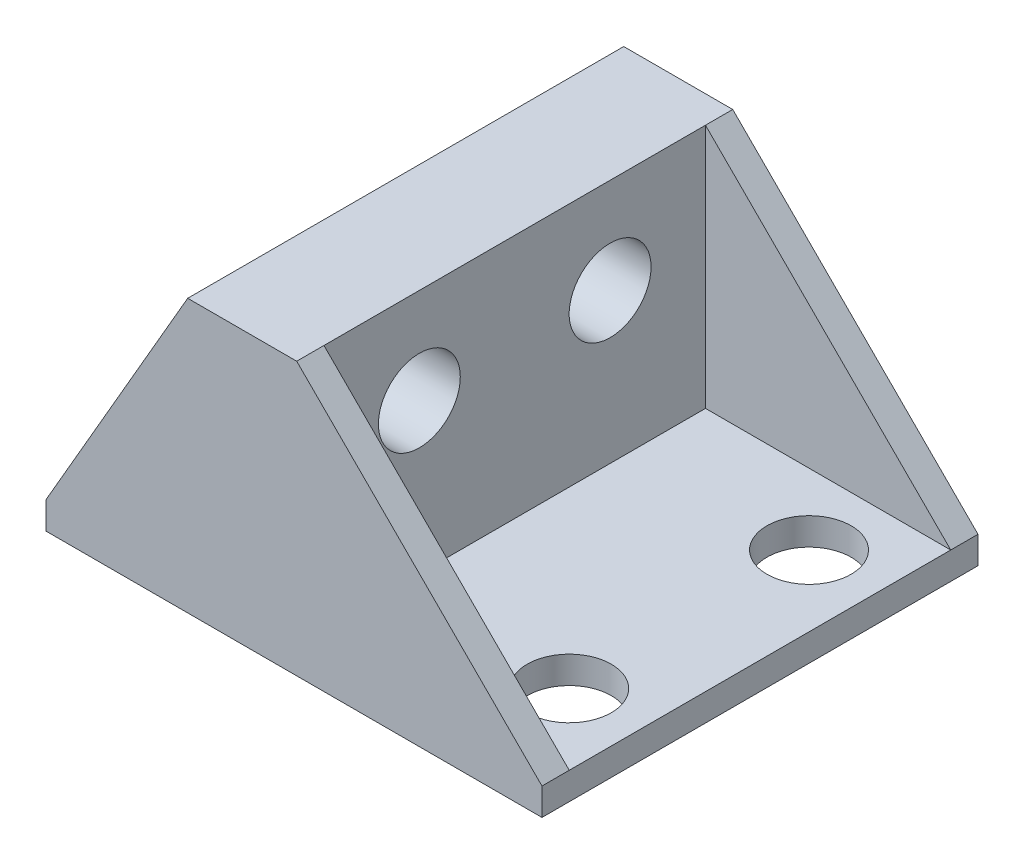
ISO-10303-21;
HEADER;
FILE_DESCRIPTION(('STEP AP214'),'2;1');
FILE_NAME('part.step','',(''),(''),'','','');
FILE_SCHEMA(('AUTOMOTIVE_DESIGN { 1 0 10303 214 1 1 1 1 }'));
ENDSEC;
DATA;
#1=APPLICATION_CONTEXT('core data for automotive mechanical design processes');
#2=APPLICATION_PROTOCOL_DEFINITION('international standard','automotive_design',2000,#1);
#3=PRODUCT_CONTEXT('',#1,'mechanical');
#4=PRODUCT('Part','Part','',(#3));
#5=PRODUCT_RELATED_PRODUCT_CATEGORY('part','',(#4));
#6=PRODUCT_DEFINITION_FORMATION('','',#4);
#7=PRODUCT_DEFINITION_CONTEXT('part definition',#1,'design');
#8=PRODUCT_DEFINITION('design','',#6,#7);
#9=PRODUCT_DEFINITION_SHAPE('','',#8);
#10=(LENGTH_UNIT() NAMED_UNIT(*) SI_UNIT(.MILLI.,.METRE.));
#11=(NAMED_UNIT(*) PLANE_ANGLE_UNIT() SI_UNIT($,.RADIAN.));
#12=(NAMED_UNIT(*) SI_UNIT($,.STERADIAN.) SOLID_ANGLE_UNIT());
#13=UNCERTAINTY_MEASURE_WITH_UNIT(LENGTH_MEASURE(1.E-05),#10,'distance_accuracy_value','');
#14=(GEOMETRIC_REPRESENTATION_CONTEXT(3) GLOBAL_UNCERTAINTY_ASSIGNED_CONTEXT((#13)) GLOBAL_UNIT_ASSIGNED_CONTEXT((#10,
#11,#12)) REPRESENTATION_CONTEXT('',''));
#15=CARTESIAN_POINT('',(0.,0.,0.));
#16=DIRECTION('',(0.,0.,1.));
#17=DIRECTION('',(1.,0.,0.));
#18=AXIS2_PLACEMENT_3D('',#15,#16,#17);
#19=CARTESIAN_POINT('',(0.,15.875,0.));
#20=DIRECTION('',(0.,-1.,0.));
#21=DIRECTION('',(0.,0.,-1.));
#22=AXIS2_PLACEMENT_3D('',#19,#20,#21);
#23=PLANE('',#22);
#24=CARTESIAN_POINT('',(107.015,15.875,8.255));
#25=DIRECTION('',(0.,1.,0.));
#26=DIRECTION('',(0.,0.,1.));
#27=AXIS2_PLACEMENT_3D('',#24,#25,#26);
#28=CIRCLE('',#27,4.90219999999998);
#29=CARTESIAN_POINT('',(107.015,15.875,13.1572));
#30=VERTEX_POINT('',#29);
#31=EDGE_CURVE('E276',#30,#30,#28,.T.);
#32=ORIENTED_EDGE('',*,*,#31,.F.);
#33=EDGE_LOOP('',(#32));
#34=FACE_BOUND('',#33,.T.);
#35=DIRECTION('',(1.,0.,0.));
#36=VECTOR('',#35,1.);
#37=CARTESIAN_POINT('',(156.545,15.875,44.45));
#38=LINE('',#37,#36);
#39=CARTESIAN_POINT('',(98.76,15.875,44.45));
#40=VERTEX_POINT('',#39);
#41=CARTESIAN_POINT('',(115.27,15.875,44.45));
#42=VERTEX_POINT('',#41);
#43=EDGE_CURVE('E225',#40,#42,#38,.T.);
#44=ORIENTED_EDGE('',*,*,#43,.T.);
#45=DIRECTION('',(0.,0.,-1.));
#46=VECTOR('',#45,1.);
#47=CARTESIAN_POINT('',(115.27,15.875,0.));
#48=LINE('',#47,#46);
#49=CARTESIAN_POINT('',(115.27,15.875,0.));
#50=VERTEX_POINT('',#49);
#51=EDGE_CURVE('E11',#42,#50,#48,.T.);
#52=ORIENTED_EDGE('',*,*,#51,.T.);
#53=DIRECTION('',(-1.,0.,0.));
#54=VECTOR('',#53,1.);
#55=CARTESIAN_POINT('',(156.545,15.875,0.));
#56=LINE('',#55,#54);
#57=CARTESIAN_POINT('',(98.76,15.875,0.));
#58=VERTEX_POINT('',#57);
#59=EDGE_CURVE('E221',#50,#58,#56,.T.);
#60=ORIENTED_EDGE('',*,*,#59,.T.);
#61=DIRECTION('',(0.,0.,1.));
#62=VECTOR('',#61,1.);
#63=CARTESIAN_POINT('',(98.76,15.875,44.45));
#64=LINE('',#63,#62);
#65=EDGE_CURVE('E220',#58,#40,#64,.T.);
#66=ORIENTED_EDGE('',*,*,#65,.T.);
#67=EDGE_LOOP('',(#44,#52,#60,#66));
#68=FACE_BOUND('',#67,.T.);
#69=CARTESIAN_POINT('',(107.015,15.875,36.195));
#70=DIRECTION('',(0.,1.,0.));
#71=DIRECTION('',(0.,0.,1.));
#72=AXIS2_PLACEMENT_3D('',#69,#70,#71);
#73=CIRCLE('',#72,4.90219999999998);
#74=CARTESIAN_POINT('',(107.015,15.875,41.0972));
#75=VERTEX_POINT('',#74);
#76=EDGE_CURVE('E266',#75,#75,#73,.T.);
#77=ORIENTED_EDGE('',*,*,#76,.F.);
#78=EDGE_LOOP('',(#77));
#79=FACE_BOUND('',#78,.T.);
#80=ADVANCED_FACE('F43',(#34,#68,#79),#23,.F.);
#81=CARTESIAN_POINT('',(127.97,44.45,44.45));
#82=DIRECTION('',(-1.,0.,0.));
#83=DIRECTION('',(0.,0.,1.));
#84=AXIS2_PLACEMENT_3D('',#81,#82,#83);
#85=PLANE('',#84);
#86=CARTESIAN_POINT('',(127.97,33.3375,33.3375));
#87=DIRECTION('',(1.,0.,0.));
#88=DIRECTION('',(0.,0.,-1.));
#89=AXIS2_PLACEMENT_3D('',#86,#87,#88);
#90=CIRCLE('',#89,4.77);
#91=CARTESIAN_POINT('',(127.97,33.3375,28.5675));
#92=VERTEX_POINT('',#91);
#93=EDGE_CURVE('E235',#92,#92,#90,.T.);
#94=ORIENTED_EDGE('',*,*,#93,.F.);
#95=EDGE_LOOP('',(#94));
#96=FACE_BOUND('',#95,.T.);
#97=CARTESIAN_POINT('',(127.97,33.3375,11.1125));
#98=DIRECTION('',(1.,0.,0.));
#99=DIRECTION('',(0.,0.,-1.));
#100=AXIS2_PLACEMENT_3D('',#97,#98,#99);
#101=CIRCLE('',#100,4.77);
#102=CARTESIAN_POINT('',(127.97,33.3375,6.34249999999999));
#103=VERTEX_POINT('',#102);
#104=EDGE_CURVE('E236',#103,#103,#101,.T.);
#105=ORIENTED_EDGE('',*,*,#104,.F.);
#106=EDGE_LOOP('',(#105));
#107=FACE_BOUND('',#106,.T.);
#108=DIRECTION('',(0.,0.,1.));
#109=VECTOR('',#108,1.);
#110=CARTESIAN_POINT('',(127.97,15.875,44.45));
#111=LINE('',#110,#109);
#112=CARTESIAN_POINT('',(127.97,15.875,0.));
#113=VERTEX_POINT('',#112);
#114=CARTESIAN_POINT('',(127.97,15.875,44.45));
#115=VERTEX_POINT('',#114);
#116=EDGE_CURVE('E230',#113,#115,#111,.T.);
#117=ORIENTED_EDGE('',*,*,#116,.F.);
#118=DIRECTION('',(0.,-1.,0.));
#119=VECTOR('',#118,1.);
#120=CARTESIAN_POINT('',(127.97,44.45,0.));
#121=LINE('',#120,#119);
#122=CARTESIAN_POINT('',(127.97,44.45,0.));
#123=VERTEX_POINT('',#122);
#124=EDGE_CURVE('E60',#123,#113,#121,.T.);
#125=ORIENTED_EDGE('',*,*,#124,.F.);
#126=DIRECTION('',(0.,0.,-1.));
#127=VECTOR('',#126,1.);
#128=CARTESIAN_POINT('',(127.97,44.45,44.45));
#129=LINE('',#128,#127);
#130=CARTESIAN_POINT('',(127.97,44.45,44.45));
#131=VERTEX_POINT('',#130);
#132=EDGE_CURVE('E242',#131,#123,#129,.T.);
#133=ORIENTED_EDGE('',*,*,#132,.F.);
#134=DIRECTION('',(0.,-1.,0.));
#135=VECTOR('',#134,1.);
#136=CARTESIAN_POINT('',(127.97,44.45,44.45));
#137=LINE('',#136,#135);
#138=EDGE_CURVE('E52',#131,#115,#137,.T.);
#139=ORIENTED_EDGE('',*,*,#138,.T.);
#140=EDGE_LOOP('',(#117,#125,#133,#139));
#141=FACE_BOUND('',#140,.T.);
#142=ADVANCED_FACE('F45',(#96,#107,#141),#85,.F.);
#143=CARTESIAN_POINT('',(115.27,44.45,0.));
#144=DIRECTION('',(1.,0.,0.));
#145=DIRECTION('',(0.,0.,-1.));
#146=AXIS2_PLACEMENT_3D('',#143,#144,#145);
#147=PLANE('',#146);
#148=CARTESIAN_POINT('',(115.27,33.3375,33.3375));
#149=DIRECTION('',(1.,0.,0.));
#150=DIRECTION('',(0.,0.,-1.));
#151=AXIS2_PLACEMENT_3D('',#148,#149,#150);
#152=CIRCLE('',#151,4.77);
#153=CARTESIAN_POINT('',(115.27,33.3375,28.5675));
#154=VERTEX_POINT('',#153);
#155=EDGE_CURVE('E239',#154,#154,#152,.T.);
#156=ORIENTED_EDGE('',*,*,#155,.T.);
#157=EDGE_LOOP('',(#156));
#158=FACE_BOUND('',#157,.T.);
#159=CARTESIAN_POINT('',(115.27,33.3375,11.1125));
#160=DIRECTION('',(1.,0.,0.));
#161=DIRECTION('',(0.,0.,-1.));
#162=AXIS2_PLACEMENT_3D('',#159,#160,#161);
#163=CIRCLE('',#162,4.77);
#164=CARTESIAN_POINT('',(115.27,33.3375,6.34249999999999));
#165=VERTEX_POINT('',#164);
#166=EDGE_CURVE('E246',#165,#165,#163,.T.);
#167=ORIENTED_EDGE('',*,*,#166,.T.);
#168=EDGE_LOOP('',(#167));
#169=FACE_BOUND('',#168,.T.);
#170=ORIENTED_EDGE('',*,*,#51,.F.);
#171=DIRECTION('',(0.,-1.,0.));
#172=VECTOR('',#171,1.);
#173=CARTESIAN_POINT('',(115.27,44.45,44.45));
#174=LINE('',#173,#172);
#175=CARTESIAN_POINT('',(115.27,44.45,44.45));
#176=VERTEX_POINT('',#175);
#177=EDGE_CURVE('E68',#176,#42,#174,.T.);
#178=ORIENTED_EDGE('',*,*,#177,.F.);
#179=DIRECTION('',(0.,0.,1.));
#180=VECTOR('',#179,1.);
#181=CARTESIAN_POINT('',(115.27,44.45,0.));
#182=LINE('',#181,#180);
#183=CARTESIAN_POINT('',(115.27,44.45,0.));
#184=VERTEX_POINT('',#183);
#185=EDGE_CURVE('E245',#184,#176,#182,.T.);
#186=ORIENTED_EDGE('',*,*,#185,.F.);
#187=DIRECTION('',(0.,-1.,0.));
#188=VECTOR('',#187,1.);
#189=CARTESIAN_POINT('',(115.27,44.45,0.));
#190=LINE('',#189,#188);
#191=EDGE_CURVE('E250',#184,#50,#190,.T.);
#192=ORIENTED_EDGE('',*,*,#191,.T.);
#193=EDGE_LOOP('',(#170,#178,#186,#192));
#194=FACE_BOUND('',#193,.T.);
#195=ADVANCED_FACE('F308',(#158,#169,#194),#147,.F.);
#196=CARTESIAN_POINT('',(0.,44.45,0.));
#197=DIRECTION('',(0.,1.,0.));
#198=DIRECTION('',(0.,0.,1.));
#199=AXIS2_PLACEMENT_3D('',#196,#197,#198);
#200=PLANE('',#199);
#201=ORIENTED_EDGE('',*,*,#185,.T.);
#202=DIRECTION('',(0.,0.,-1.));
#203=VECTOR('',#202,1.);
#204=CARTESIAN_POINT('',(115.27,44.45,47.625));
#205=LINE('',#204,#203);
#206=CARTESIAN_POINT('',(115.27,44.45,47.625));
#207=VERTEX_POINT('',#206);
#208=EDGE_CURVE('E188',#207,#176,#205,.T.);
#209=ORIENTED_EDGE('',*,*,#208,.F.);
#210=DIRECTION('',(1.,0.,0.));
#211=VECTOR('',#210,1.);
#212=CARTESIAN_POINT('',(115.27,44.45,47.625));
#213=LINE('',#212,#211);
#214=CARTESIAN_POINT('',(127.97,44.45,47.625));
#215=VERTEX_POINT('',#214);
#216=EDGE_CURVE('E172',#207,#215,#213,.T.);
#217=ORIENTED_EDGE('',*,*,#216,.T.);
#218=DIRECTION('',(0.,0.,-1.));
#219=VECTOR('',#218,1.);
#220=CARTESIAN_POINT('',(127.97,44.45,47.625));
#221=LINE('',#220,#219);
#222=EDGE_CURVE('E185',#215,#131,#221,.T.);
#223=ORIENTED_EDGE('',*,*,#222,.T.);
#224=ORIENTED_EDGE('',*,*,#132,.T.);
#225=DIRECTION('',(0.,0.,1.));
#226=VECTOR('',#225,1.);
#227=CARTESIAN_POINT('',(127.97,44.45,-3.175));
#228=LINE('',#227,#226);
#229=CARTESIAN_POINT('',(127.97,44.45,-3.175));
#230=VERTEX_POINT('',#229);
#231=EDGE_CURVE('E211',#230,#123,#228,.T.);
#232=ORIENTED_EDGE('',*,*,#231,.F.);
#233=DIRECTION('',(1.,0.,0.));
#234=VECTOR('',#233,1.);
#235=CARTESIAN_POINT('',(127.97,44.45,-3.175));
#236=LINE('',#235,#234);
#237=CARTESIAN_POINT('',(115.27,44.45,-3.175));
#238=VERTEX_POINT('',#237);
#239=EDGE_CURVE('E197',#238,#230,#236,.T.);
#240=ORIENTED_EDGE('',*,*,#239,.F.);
#241=DIRECTION('',(0.,0.,1.));
#242=VECTOR('',#241,1.);
#243=CARTESIAN_POINT('',(115.27,44.45,-3.175));
#244=LINE('',#243,#242);
#245=EDGE_CURVE('E213',#238,#184,#244,.T.);
#246=ORIENTED_EDGE('',*,*,#245,.T.);
#247=EDGE_LOOP('',(#201,#209,#217,#223,#224,#232,#240,#246));
#248=FACE_BOUND('',#247,.T.);
#249=ADVANCED_FACE('F345',(#248),#200,.T.);
#250=CARTESIAN_POINT('',(0.,12.7,0.));
#251=DIRECTION('',(0.,1.,0.));
#252=DIRECTION('',(0.,0.,1.));
#253=AXIS2_PLACEMENT_3D('',#250,#251,#252);
#254=PLANE('',#253);
#255=CARTESIAN_POINT('',(107.015,12.7,8.255));
#256=DIRECTION('',(0.,1.,0.));
#257=DIRECTION('',(0.,0.,1.));
#258=AXIS2_PLACEMENT_3D('',#255,#256,#257);
#259=CIRCLE('',#258,4.90219999999997);
#260=CARTESIAN_POINT('',(107.015,12.7,13.1572));
#261=VERTEX_POINT('',#260);
#262=EDGE_CURVE('E47',#261,#261,#259,.T.);
#263=ORIENTED_EDGE('',*,*,#262,.T.);
#264=EDGE_LOOP('',(#263));
#265=FACE_BOUND('',#264,.T.);
#266=CARTESIAN_POINT('',(107.015,12.7,36.195));
#267=DIRECTION('',(0.,1.,0.));
#268=DIRECTION('',(0.,0.,1.));
#269=AXIS2_PLACEMENT_3D('',#266,#267,#268);
#270=CIRCLE('',#269,4.90219999999997);
#271=CARTESIAN_POINT('',(107.015,12.7,41.0972));
#272=VERTEX_POINT('',#271);
#273=EDGE_CURVE('E264',#272,#272,#270,.T.);
#274=ORIENTED_EDGE('',*,*,#273,.T.);
#275=EDGE_LOOP('',(#274));
#276=FACE_BOUND('',#275,.T.);
#277=CARTESIAN_POINT('',(148.29,12.7,8.255));
#278=DIRECTION('',(0.,1.,0.));
#279=DIRECTION('',(0.,0.,1.));
#280=AXIS2_PLACEMENT_3D('',#277,#278,#279);
#281=CIRCLE('',#280,4.90219999999995);
#282=CARTESIAN_POINT('',(148.29,12.7,13.1572));
#283=VERTEX_POINT('',#282);
#284=EDGE_CURVE('E260',#283,#283,#281,.T.);
#285=ORIENTED_EDGE('',*,*,#284,.T.);
#286=EDGE_LOOP('',(#285));
#287=FACE_BOUND('',#286,.T.);
#288=CARTESIAN_POINT('',(148.29,12.7,36.195));
#289=DIRECTION('',(0.,1.,0.));
#290=DIRECTION('',(0.,0.,1.));
#291=AXIS2_PLACEMENT_3D('',#288,#289,#290);
#292=CIRCLE('',#291,4.90219999999995);
#293=CARTESIAN_POINT('',(148.29,12.7,41.0972));
#294=VERTEX_POINT('',#293);
#295=EDGE_CURVE('E168',#294,#294,#292,.T.);
#296=ORIENTED_EDGE('',*,*,#295,.T.);
#297=EDGE_LOOP('',(#296));
#298=FACE_BOUND('',#297,.T.);
#299=DIRECTION('',(0.,0.,-1.));
#300=VECTOR('',#299,1.);
#301=CARTESIAN_POINT('',(156.545,12.7,0.));
#302=LINE('',#301,#300);
#303=CARTESIAN_POINT('',(156.545,12.7,47.625));
#304=VERTEX_POINT('',#303);
#305=CARTESIAN_POINT('',(156.545,12.7,-3.175));
#306=VERTEX_POINT('',#305);
#307=EDGE_CURVE('E147',#304,#306,#302,.T.);
#308=ORIENTED_EDGE('',*,*,#307,.F.);
#309=DIRECTION('',(-1.,0.,0.));
#310=VECTOR('',#309,1.);
#311=CARTESIAN_POINT('',(115.27,12.7,47.625));
#312=LINE('',#311,#310);
#313=CARTESIAN_POINT('',(98.76,12.7,47.625));
#314=VERTEX_POINT('',#313);
#315=EDGE_CURVE('E155',#304,#314,#312,.T.);
#316=ORIENTED_EDGE('',*,*,#315,.T.);
#317=DIRECTION('',(0.,0.,1.));
#318=VECTOR('',#317,1.);
#319=CARTESIAN_POINT('',(98.76,12.7,44.45));
#320=LINE('',#319,#318);
#321=CARTESIAN_POINT('',(98.76,12.7,-3.175));
#322=VERTEX_POINT('',#321);
#323=EDGE_CURVE('E136',#322,#314,#320,.T.);
#324=ORIENTED_EDGE('',*,*,#323,.F.);
#325=DIRECTION('',(-1.,0.,0.));
#326=VECTOR('',#325,1.);
#327=CARTESIAN_POINT('',(98.76,12.7,-3.175));
#328=LINE('',#327,#326);
#329=EDGE_CURVE('E191',#306,#322,#328,.T.);
#330=ORIENTED_EDGE('',*,*,#329,.F.);
#331=EDGE_LOOP('',(#308,#316,#324,#330));
#332=FACE_BOUND('',#331,.T.);
#333=ADVANCED_FACE('F161',(#265,#276,#287,#298,#332),#254,.F.);
#334=CARTESIAN_POINT('',(108.92,33.3375,33.3375));
#335=DIRECTION('',(1.,0.,0.));
#336=DIRECTION('',(0.,0.,-1.));
#337=AXIS2_PLACEMENT_3D('',#334,#335,#336);
#338=CYLINDRICAL_SURFACE('',#337,4.77);
#339=CARTESIAN_POINT('',(127.97,33.3375,28.5675));
#340=CARTESIAN_POINT('',(127.837708333333,33.3375,28.5675));
#341=CARTESIAN_POINT('',(127.705416666667,33.3375,28.5675));
#342=CARTESIAN_POINT('',(127.440833333333,33.3375,28.5675));
#343=CARTESIAN_POINT('',(127.308541666667,33.3375,28.5675));
#344=CARTESIAN_POINT('',(127.043958333333,33.3375,28.5675));
#345=CARTESIAN_POINT('',(126.911666666667,33.3375,28.5675));
#346=CARTESIAN_POINT('',(126.647083333333,33.3375,28.5675));
#347=CARTESIAN_POINT('',(126.514791666667,33.3375,28.5675));
#348=CARTESIAN_POINT('',(126.250208333333,33.3375,28.5675));
#349=CARTESIAN_POINT('',(126.117916666667,33.3375,28.5675));
#350=CARTESIAN_POINT('',(125.853333333333,33.3375,28.5675));
#351=CARTESIAN_POINT('',(125.721041666667,33.3375,28.5675));
#352=CARTESIAN_POINT('',(125.456458333333,33.3375,28.5675));
#353=CARTESIAN_POINT('',(125.324166666667,33.3375,28.5675));
#354=CARTESIAN_POINT('',(125.059583333333,33.3375,28.5675));
#355=CARTESIAN_POINT('',(124.927291666667,33.3375,28.5675));
#356=CARTESIAN_POINT('',(124.662708333333,33.3375,28.5675));
#357=CARTESIAN_POINT('',(124.530416666667,33.3375,28.5675));
#358=CARTESIAN_POINT('',(124.265833333333,33.3375,28.5675));
#359=CARTESIAN_POINT('',(124.133541666667,33.3375,28.5675));
#360=CARTESIAN_POINT('',(123.868958333333,33.3375,28.5675));
#361=CARTESIAN_POINT('',(123.736666666667,33.3375,28.5675));
#362=CARTESIAN_POINT('',(123.472083333333,33.3375,28.5675));
#363=CARTESIAN_POINT('',(123.339791666667,33.3375,28.5675));
#364=CARTESIAN_POINT('',(123.075208333333,33.3375,28.5675));
#365=CARTESIAN_POINT('',(122.942916666667,33.3375,28.5675));
#366=CARTESIAN_POINT('',(122.678333333333,33.3375,28.5675));
#367=CARTESIAN_POINT('',(122.546041666667,33.3375,28.5675));
#368=CARTESIAN_POINT('',(122.281458333333,33.3375,28.5675));
#369=CARTESIAN_POINT('',(122.149166666667,33.3375,28.5675));
#370=CARTESIAN_POINT('',(121.884583333333,33.3375,28.5675));
#371=CARTESIAN_POINT('',(121.752291666667,33.3375,28.5675));
#372=CARTESIAN_POINT('',(121.487708333333,33.3375,28.5675));
#373=CARTESIAN_POINT('',(121.355416666667,33.3375,28.5675));
#374=CARTESIAN_POINT('',(121.090833333333,33.3375,28.5675));
#375=CARTESIAN_POINT('',(120.958541666667,33.3375,28.5675));
#376=CARTESIAN_POINT('',(120.693958333333,33.3375,28.5675));
#377=CARTESIAN_POINT('',(120.561666666667,33.3375,28.5675));
#378=CARTESIAN_POINT('',(120.297083333333,33.3375,28.5675));
#379=CARTESIAN_POINT('',(120.164791666667,33.3375,28.5675));
#380=CARTESIAN_POINT('',(119.900208333333,33.3375,28.5675));
#381=CARTESIAN_POINT('',(119.767916666667,33.3375,28.5675));
#382=CARTESIAN_POINT('',(119.503333333333,33.3375,28.5675));
#383=CARTESIAN_POINT('',(119.371041666667,33.3375,28.5675));
#384=CARTESIAN_POINT('',(119.106458333333,33.3375,28.5675));
#385=CARTESIAN_POINT('',(118.974166666667,33.3375,28.5675));
#386=CARTESIAN_POINT('',(118.709583333333,33.3375,28.5675));
#387=CARTESIAN_POINT('',(118.577291666667,33.3375,28.5675));
#388=CARTESIAN_POINT('',(118.312708333333,33.3375,28.5675));
#389=CARTESIAN_POINT('',(118.180416666667,33.3375,28.5675));
#390=CARTESIAN_POINT('',(117.915833333333,33.3375,28.5675));
#391=CARTESIAN_POINT('',(117.783541666667,33.3375,28.5675));
#392=CARTESIAN_POINT('',(117.518958333333,33.3375,28.5675));
#393=CARTESIAN_POINT('',(117.386666666667,33.3375,28.5675));
#394=CARTESIAN_POINT('',(117.122083333333,33.3375,28.5675));
#395=CARTESIAN_POINT('',(116.989791666667,33.3375,28.5675));
#396=CARTESIAN_POINT('',(116.725208333333,33.3375,28.5675));
#397=CARTESIAN_POINT('',(116.592916666667,33.3375,28.5675));
#398=CARTESIAN_POINT('',(116.328333333333,33.3375,28.5675));
#399=CARTESIAN_POINT('',(116.196041666667,33.3375,28.5675));
#400=CARTESIAN_POINT('',(115.931458333333,33.3375,28.5675));
#401=CARTESIAN_POINT('',(115.799166666667,33.3375,28.5675));
#402=CARTESIAN_POINT('',(115.534583333333,33.3375,28.5675));
#403=CARTESIAN_POINT('',(115.402291666667,33.3375,28.5675));
#404=CARTESIAN_POINT('',(115.27,33.3375,28.5675));
#405=B_SPLINE_CURVE_WITH_KNOTS('',3,(#339,#340,#341,#342,#343,#344,#345,#346,#347,#348,#349,
#350,#351,#352,#353,#354,#355,#356,#357,#358,#359,#360,#361,#362,#363,#364,#365,#366,#367,#368,
#369,#370,#371,#372,#373,#374,#375,#376,#377,#378,#379,#380,#381,#382,#383,#384,#385,#386,#387,
#388,#389,#390,#391,#392,#393,#394,#395,#396,#397,#398,#399,#400,#401,#402,#403,#404),
.UNSPECIFIED.,.F.,.F.,(4,2,2,2,2,2,2,2,2,2,2,2,2,2,2,2,2,2,2,2,2,2,2,2,2,2,2,2,2,2,2,2,4),(0.,
0.396874999999991,0.793749999999982,1.19062499999997,1.58749999999999,1.98437499999998,
2.38124999999997,2.77812499999999,3.17499999999998,3.57187499999999,3.96874999999998,
4.36562499999998,4.76249999999998,5.15937499999998,5.55624999999998,5.95312499999998,
6.34999999999998,6.74687499999999,7.14374999999998,7.54062499999998,7.93749999999997,
8.33437499999998,8.73124999999997,9.12812499999997,9.52499999999998,9.92187499999997,10.31875,
10.715625,11.1125,11.509375,11.90625,12.303125,12.7),.UNSPECIFIED.);
#406=EDGE_CURVE('BSEAM374',#92,#154,#405,.T.);
#407=ORIENTED_EDGE('',*,*,#93,.T.);
#408=ORIENTED_EDGE('',*,*,#155,.F.);
#409=ORIENTED_EDGE('',*,*,#406,.T.);
#410=ORIENTED_EDGE('',*,*,#406,.F.);
#411=EDGE_LOOP('',(#407,#409,#408,#410));
#412=FACE_BOUND('',#411,.T.);
#413=ADVANCED_FACE('F374',(#412),#338,.F.);
#414=CARTESIAN_POINT('',(108.92,33.3375,11.1125));
#415=DIRECTION('',(1.,0.,0.));
#416=DIRECTION('',(0.,0.,-1.));
#417=AXIS2_PLACEMENT_3D('',#414,#415,#416);
#418=CYLINDRICAL_SURFACE('',#417,4.77);
#419=CARTESIAN_POINT('',(127.97,33.3375,6.34249999999999));
#420=CARTESIAN_POINT('',(127.837708333333,33.3375,6.34249999999999));
#421=CARTESIAN_POINT('',(127.705416666667,33.3375,6.34249999999999));
#422=CARTESIAN_POINT('',(127.440833333333,33.3375,6.34249999999999));
#423=CARTESIAN_POINT('',(127.308541666667,33.3375,6.34249999999999));
#424=CARTESIAN_POINT('',(127.043958333333,33.3375,6.34249999999999));
#425=CARTESIAN_POINT('',(126.911666666667,33.3375,6.34249999999999));
#426=CARTESIAN_POINT('',(126.647083333333,33.3375,6.34249999999999));
#427=CARTESIAN_POINT('',(126.514791666667,33.3375,6.34249999999999));
#428=CARTESIAN_POINT('',(126.250208333333,33.3375,6.34249999999999));
#429=CARTESIAN_POINT('',(126.117916666667,33.3375,6.34249999999999));
#430=CARTESIAN_POINT('',(125.853333333333,33.3375,6.34249999999999));
#431=CARTESIAN_POINT('',(125.721041666667,33.3375,6.34249999999999));
#432=CARTESIAN_POINT('',(125.456458333333,33.3375,6.34249999999999));
#433=CARTESIAN_POINT('',(125.324166666667,33.3375,6.34249999999999));
#434=CARTESIAN_POINT('',(125.059583333333,33.3375,6.34249999999999));
#435=CARTESIAN_POINT('',(124.927291666667,33.3375,6.34249999999999));
#436=CARTESIAN_POINT('',(124.662708333333,33.3375,6.34249999999999));
#437=CARTESIAN_POINT('',(124.530416666667,33.3375,6.34249999999999));
#438=CARTESIAN_POINT('',(124.265833333333,33.3375,6.34249999999999));
#439=CARTESIAN_POINT('',(124.133541666667,33.3375,6.34249999999999));
#440=CARTESIAN_POINT('',(123.868958333333,33.3375,6.34249999999999));
#441=CARTESIAN_POINT('',(123.736666666667,33.3375,6.34249999999999));
#442=CARTESIAN_POINT('',(123.472083333333,33.3375,6.34249999999999));
#443=CARTESIAN_POINT('',(123.339791666667,33.3375,6.34249999999999));
#444=CARTESIAN_POINT('',(123.075208333333,33.3375,6.34249999999999));
#445=CARTESIAN_POINT('',(122.942916666667,33.3375,6.34249999999999));
#446=CARTESIAN_POINT('',(122.678333333333,33.3375,6.34249999999999));
#447=CARTESIAN_POINT('',(122.546041666667,33.3375,6.34249999999999));
#448=CARTESIAN_POINT('',(122.281458333333,33.3375,6.34249999999999));
#449=CARTESIAN_POINT('',(122.149166666667,33.3375,6.34249999999999));
#450=CARTESIAN_POINT('',(121.884583333333,33.3375,6.34249999999999));
#451=CARTESIAN_POINT('',(121.752291666667,33.3375,6.34249999999999));
#452=CARTESIAN_POINT('',(121.487708333333,33.3375,6.34249999999999));
#453=CARTESIAN_POINT('',(121.355416666667,33.3375,6.34249999999999));
#454=CARTESIAN_POINT('',(121.090833333333,33.3375,6.34249999999999));
#455=CARTESIAN_POINT('',(120.958541666667,33.3375,6.34249999999999));
#456=CARTESIAN_POINT('',(120.693958333333,33.3375,6.34249999999999));
#457=CARTESIAN_POINT('',(120.561666666667,33.3375,6.34249999999999));
#458=CARTESIAN_POINT('',(120.297083333333,33.3375,6.34249999999999));
#459=CARTESIAN_POINT('',(120.164791666667,33.3375,6.34249999999999));
#460=CARTESIAN_POINT('',(119.900208333333,33.3375,6.34249999999999));
#461=CARTESIAN_POINT('',(119.767916666667,33.3375,6.34249999999999));
#462=CARTESIAN_POINT('',(119.503333333333,33.3375,6.34249999999999));
#463=CARTESIAN_POINT('',(119.371041666667,33.3375,6.34249999999999));
#464=CARTESIAN_POINT('',(119.106458333333,33.3375,6.34249999999999));
#465=CARTESIAN_POINT('',(118.974166666667,33.3375,6.34249999999999));
#466=CARTESIAN_POINT('',(118.709583333333,33.3375,6.34249999999999));
#467=CARTESIAN_POINT('',(118.577291666667,33.3375,6.34249999999999));
#468=CARTESIAN_POINT('',(118.312708333333,33.3375,6.34249999999999));
#469=CARTESIAN_POINT('',(118.180416666667,33.3375,6.34249999999999));
#470=CARTESIAN_POINT('',(117.915833333333,33.3375,6.34249999999999));
#471=CARTESIAN_POINT('',(117.783541666667,33.3375,6.34249999999999));
#472=CARTESIAN_POINT('',(117.518958333333,33.3375,6.34249999999999));
#473=CARTESIAN_POINT('',(117.386666666667,33.3375,6.34249999999999));
#474=CARTESIAN_POINT('',(117.122083333333,33.3375,6.34249999999999));
#475=CARTESIAN_POINT('',(116.989791666667,33.3375,6.34249999999999));
#476=CARTESIAN_POINT('',(116.725208333333,33.3375,6.34249999999999));
#477=CARTESIAN_POINT('',(116.592916666667,33.3375,6.34249999999999));
#478=CARTESIAN_POINT('',(116.328333333333,33.3375,6.34249999999999));
#479=CARTESIAN_POINT('',(116.196041666667,33.3375,6.34249999999999));
#480=CARTESIAN_POINT('',(115.931458333333,33.3375,6.34249999999999));
#481=CARTESIAN_POINT('',(115.799166666667,33.3375,6.34249999999999));
#482=CARTESIAN_POINT('',(115.534583333333,33.3375,6.34249999999999));
#483=CARTESIAN_POINT('',(115.402291666667,33.3375,6.34249999999999));
#484=CARTESIAN_POINT('',(115.27,33.3375,6.34249999999999));
#485=B_SPLINE_CURVE_WITH_KNOTS('',3,(#419,#420,#421,#422,#423,#424,#425,#426,#427,#428,#429,
#430,#431,#432,#433,#434,#435,#436,#437,#438,#439,#440,#441,#442,#443,#444,#445,#446,#447,#448,
#449,#450,#451,#452,#453,#454,#455,#456,#457,#458,#459,#460,#461,#462,#463,#464,#465,#466,#467,
#468,#469,#470,#471,#472,#473,#474,#475,#476,#477,#478,#479,#480,#481,#482,#483,#484),
.UNSPECIFIED.,.F.,.F.,(4,2,2,2,2,2,2,2,2,2,2,2,2,2,2,2,2,2,2,2,2,2,2,2,2,2,2,2,2,2,2,2,4),(0.,
0.396874999999991,0.793749999999982,1.19062499999997,1.58749999999999,1.98437499999998,
2.38124999999997,2.77812499999999,3.17499999999998,3.57187499999999,3.96874999999998,
4.36562499999998,4.76249999999998,5.15937499999998,5.55624999999998,5.95312499999998,
6.34999999999998,6.74687499999999,7.14374999999998,7.54062499999998,7.93749999999997,
8.33437499999998,8.73124999999997,9.12812499999997,9.52499999999998,9.92187499999997,10.31875,
10.715625,11.1125,11.509375,11.90625,12.303125,12.7),.UNSPECIFIED.);
#486=EDGE_CURVE('BSEAM325',#103,#165,#485,.T.);
#487=ORIENTED_EDGE('',*,*,#104,.T.);
#488=ORIENTED_EDGE('',*,*,#166,.F.);
#489=ORIENTED_EDGE('',*,*,#486,.T.);
#490=ORIENTED_EDGE('',*,*,#486,.F.);
#491=EDGE_LOOP('',(#487,#489,#488,#490));
#492=FACE_BOUND('',#491,.T.);
#493=ADVANCED_FACE('F325',(#492),#418,.F.);
#494=CARTESIAN_POINT('',(98.76,15.875,44.45));
#495=DIRECTION('',(1.,0.,0.));
#496=DIRECTION('',(0.,0.,-1.));
#497=AXIS2_PLACEMENT_3D('',#494,#495,#496);
#498=PLANE('',#497);
#499=ORIENTED_EDGE('',*,*,#323,.T.);
#500=DIRECTION('',(0.,1.,0.));
#501=VECTOR('',#500,1.);
#502=CARTESIAN_POINT('',(98.76,44.45,47.625));
#503=LINE('',#502,#501);
#504=CARTESIAN_POINT('',(98.76,15.875,47.625));
#505=VERTEX_POINT('',#504);
#506=EDGE_CURVE('E140',#314,#505,#503,.T.);
#507=ORIENTED_EDGE('',*,*,#506,.T.);
#508=DIRECTION('',(0.,0.,-1.));
#509=VECTOR('',#508,1.);
#510=CARTESIAN_POINT('',(98.76,15.875,47.625));
#511=LINE('',#510,#509);
#512=EDGE_CURVE('E180',#505,#40,#511,.T.);
#513=ORIENTED_EDGE('',*,*,#512,.T.);
#514=ORIENTED_EDGE('',*,*,#65,.F.);
#515=DIRECTION('',(0.,0.,1.));
#516=VECTOR('',#515,1.);
#517=CARTESIAN_POINT('',(98.76,15.875,-3.175));
#518=LINE('',#517,#516);
#519=CARTESIAN_POINT('',(98.76,15.875,-3.175));
#520=VERTEX_POINT('',#519);
#521=EDGE_CURVE('E148',#520,#58,#518,.T.);
#522=ORIENTED_EDGE('',*,*,#521,.F.);
#523=DIRECTION('',(0.,1.,0.));
#524=VECTOR('',#523,1.);
#525=CARTESIAN_POINT('',(98.76,15.875,-3.175));
#526=LINE('',#525,#524);
#527=EDGE_CURVE('E142',#322,#520,#526,.T.);
#528=ORIENTED_EDGE('',*,*,#527,.F.);
#529=EDGE_LOOP('',(#499,#507,#513,#514,#522,#528));
#530=FACE_BOUND('',#529,.T.);
#531=ADVANCED_FACE('F138',(#530),#498,.F.);
#532=CARTESIAN_POINT('',(148.29,15.875,8.255));
#533=DIRECTION('',(0.,1.,0.));
#534=DIRECTION('',(0.,0.,1.));
#535=AXIS2_PLACEMENT_3D('',#532,#533,#534);
#536=CIRCLE('',#535,4.90219999999997);
#537=CARTESIAN_POINT('',(148.29,15.875,13.1572));
#538=VERTEX_POINT('',#537);
#539=EDGE_CURVE('E263',#538,#538,#536,.T.);
#540=ORIENTED_EDGE('',*,*,#539,.F.);
#541=EDGE_LOOP('',(#540));
#542=FACE_BOUND('',#541,.T.);
#543=CARTESIAN_POINT('',(148.29,15.875,36.195));
#544=DIRECTION('',(0.,1.,0.));
#545=DIRECTION('',(0.,0.,1.));
#546=AXIS2_PLACEMENT_3D('',#543,#544,#545);
#547=CIRCLE('',#546,4.90219999999997);
#548=CARTESIAN_POINT('',(148.29,15.875,41.0972));
#549=VERTEX_POINT('',#548);
#550=EDGE_CURVE('E262',#549,#549,#547,.T.);
#551=ORIENTED_EDGE('',*,*,#550,.F.);
#552=EDGE_LOOP('',(#551));
#553=FACE_BOUND('',#552,.T.);
#554=CARTESIAN_POINT('',(156.545,15.875,0.));
#555=VERTEX_POINT('',#554);
#556=EDGE_CURVE('E217',#555,#113,#56,.T.);
#557=ORIENTED_EDGE('',*,*,#556,.T.);
#558=ORIENTED_EDGE('',*,*,#116,.T.);
#559=CARTESIAN_POINT('',(156.545,15.875,44.45));
#560=VERTEX_POINT('',#559);
#561=EDGE_CURVE('E224',#115,#560,#38,.T.);
#562=ORIENTED_EDGE('',*,*,#561,.T.);
#563=DIRECTION('',(0.,0.,-1.));
#564=VECTOR('',#563,1.);
#565=CARTESIAN_POINT('',(156.545,15.875,0.));
#566=LINE('',#565,#564);
#567=EDGE_CURVE('E228',#560,#555,#566,.T.);
#568=ORIENTED_EDGE('',*,*,#567,.T.);
#569=EDGE_LOOP('',(#557,#558,#562,#568));
#570=FACE_BOUND('',#569,.T.);
#571=ADVANCED_FACE('F303',(#542,#553,#570),#23,.F.);
#572=CARTESIAN_POINT('',(156.545,15.875,0.));
#573=DIRECTION('',(-1.,0.,0.));
#574=DIRECTION('',(0.,0.,1.));
#575=AXIS2_PLACEMENT_3D('',#572,#573,#574);
#576=PLANE('',#575);
#577=ORIENTED_EDGE('',*,*,#307,.T.);
#578=DIRECTION('',(0.,-1.,0.));
#579=VECTOR('',#578,1.);
#580=CARTESIAN_POINT('',(156.545,12.7,-3.175));
#581=LINE('',#580,#579);
#582=CARTESIAN_POINT('',(156.545,15.875,-3.175));
#583=VERTEX_POINT('',#582);
#584=EDGE_CURVE('E201',#583,#306,#581,.T.);
#585=ORIENTED_EDGE('',*,*,#584,.F.);
#586=DIRECTION('',(0.,0.,1.));
#587=VECTOR('',#586,1.);
#588=CARTESIAN_POINT('',(156.545,15.875,-3.175));
#589=LINE('',#588,#587);
#590=EDGE_CURVE('E204',#583,#555,#589,.T.);
#591=ORIENTED_EDGE('',*,*,#590,.T.);
#592=ORIENTED_EDGE('',*,*,#567,.F.);
#593=DIRECTION('',(0.,0.,-1.));
#594=VECTOR('',#593,1.);
#595=CARTESIAN_POINT('',(156.545,15.875,47.625));
#596=LINE('',#595,#594);
#597=CARTESIAN_POINT('',(156.545,15.875,47.625));
#598=VERTEX_POINT('',#597);
#599=EDGE_CURVE('E182',#598,#560,#596,.T.);
#600=ORIENTED_EDGE('',*,*,#599,.F.);
#601=DIRECTION('',(0.,-1.,0.));
#602=VECTOR('',#601,1.);
#603=CARTESIAN_POINT('',(156.545,44.45,47.625));
#604=LINE('',#603,#602);
#605=EDGE_CURVE('E178',#598,#304,#604,.T.);
#606=ORIENTED_EDGE('',*,*,#605,.T.);
#607=EDGE_LOOP('',(#577,#585,#591,#592,#600,#606));
#608=FACE_BOUND('',#607,.T.);
#609=ADVANCED_FACE('F315',(#608),#576,.F.);
#610=CARTESIAN_POINT('',(0.,0.,0.));
#611=DIRECTION('',(0.,0.,1.));
#612=DIRECTION('',(1.,0.,0.));
#613=AXIS2_PLACEMENT_3D('',#610,#611,#612);
#614=PLANE('',#613);
#615=ORIENTED_EDGE('',*,*,#59,.F.);
#616=ORIENTED_EDGE('',*,*,#191,.F.);
#617=DIRECTION('',(0.500277597874629,0.865865073244551,0.));
#618=VECTOR('',#617,1.);
#619=CARTESIAN_POINT('',(115.27,44.45,0.));
#620=LINE('',#619,#618);
#621=EDGE_CURVE('E184',#58,#184,#620,.T.);
#622=ORIENTED_EDGE('',*,*,#621,.F.);
#623=EDGE_LOOP('',(#615,#616,#622));
#624=FACE_BOUND('',#623,.T.);
#625=ADVANCED_FACE('F322',(#624),#614,.T.);
#626=CARTESIAN_POINT('',(115.27,44.45,-3.175));
#627=DIRECTION('',(0.86586507324455,-0.500277597874629,0.));
#628=DIRECTION('',(0.500277597874629,0.865865073244551,0.));
#629=AXIS2_PLACEMENT_3D('',#626,#627,#628);
#630=PLANE('',#629);
#631=ORIENTED_EDGE('',*,*,#621,.T.);
#632=ORIENTED_EDGE('',*,*,#245,.F.);
#633=DIRECTION('',(0.500277597874629,0.865865073244551,0.));
#634=VECTOR('',#633,1.);
#635=CARTESIAN_POINT('',(115.27,44.45,-3.175));
#636=LINE('',#635,#634);
#637=EDGE_CURVE('E195',#520,#238,#636,.T.);
#638=ORIENTED_EDGE('',*,*,#637,.F.);
#639=ORIENTED_EDGE('',*,*,#521,.T.);
#640=EDGE_LOOP('',(#631,#632,#638,#639));
#641=FACE_BOUND('',#640,.T.);
#642=ADVANCED_FACE('F399',(#641),#630,.F.);
#643=CARTESIAN_POINT('',(156.545,15.875,-3.175));
#644=DIRECTION('',(-0.707106781186547,-0.707106781186548,0.));
#645=DIRECTION('',(0.707106781186548,-0.707106781186547,0.));
#646=AXIS2_PLACEMENT_3D('',#643,#644,#645);
#647=PLANE('',#646);
#648=DIRECTION('',(0.707106781186548,-0.707106781186547,0.));
#649=VECTOR('',#648,1.);
#650=CARTESIAN_POINT('',(156.545,15.875,0.));
#651=LINE('',#650,#649);
#652=EDGE_CURVE('E193',#123,#555,#651,.T.);
#653=ORIENTED_EDGE('',*,*,#652,.T.);
#654=ORIENTED_EDGE('',*,*,#590,.F.);
#655=DIRECTION('',(0.707106781186548,-0.707106781186547,0.));
#656=VECTOR('',#655,1.);
#657=CARTESIAN_POINT('',(156.545,15.875,-3.175));
#658=LINE('',#657,#656);
#659=EDGE_CURVE('E199',#230,#583,#658,.T.);
#660=ORIENTED_EDGE('',*,*,#659,.F.);
#661=ORIENTED_EDGE('',*,*,#231,.T.);
#662=EDGE_LOOP('',(#653,#654,#660,#661));
#663=FACE_BOUND('',#662,.T.);
#664=ADVANCED_FACE('F335',(#663),#647,.F.);
#665=CARTESIAN_POINT('',(0.,0.,-3.175));
#666=DIRECTION('',(0.,0.,1.));
#667=DIRECTION('',(1.,0.,0.));
#668=AXIS2_PLACEMENT_3D('',#665,#666,#667);
#669=PLANE('',#668);
#670=ORIENTED_EDGE('',*,*,#329,.T.);
#671=ORIENTED_EDGE('',*,*,#527,.T.);
#672=ORIENTED_EDGE('',*,*,#637,.T.);
#673=ORIENTED_EDGE('',*,*,#239,.T.);
#674=ORIENTED_EDGE('',*,*,#659,.T.);
#675=ORIENTED_EDGE('',*,*,#584,.T.);
#676=EDGE_LOOP('',(#670,#671,#672,#673,#674,#675));
#677=FACE_BOUND('',#676,.T.);
#678=ADVANCED_FACE('F340',(#677),#669,.F.);
#679=ORIENTED_EDGE('',*,*,#652,.F.);
#680=ORIENTED_EDGE('',*,*,#124,.T.);
#681=ORIENTED_EDGE('',*,*,#556,.F.);
#682=EDGE_LOOP('',(#679,#680,#681));
#683=FACE_BOUND('',#682,.T.);
#684=ADVANCED_FACE('F332',(#683),#614,.T.);
#685=CARTESIAN_POINT('',(0.,0.,44.45));
#686=DIRECTION('',(0.,0.,-1.));
#687=DIRECTION('',(-1.,0.,0.));
#688=AXIS2_PLACEMENT_3D('',#685,#686,#687);
#689=PLANE('',#688);
#690=ORIENTED_EDGE('',*,*,#561,.F.);
#691=ORIENTED_EDGE('',*,*,#138,.F.);
#692=DIRECTION('',(0.707106781186548,-0.707106781186547,0.));
#693=VECTOR('',#692,1.);
#694=CARTESIAN_POINT('',(121.62,50.8,44.45));
#695=LINE('',#694,#693);
#696=EDGE_CURVE('E162',#131,#560,#695,.T.);
#697=ORIENTED_EDGE('',*,*,#696,.T.);
#698=EDGE_LOOP('',(#690,#691,#697));
#699=FACE_BOUND('',#698,.T.);
#700=ADVANCED_FACE('F298',(#699),#689,.T.);
#701=CARTESIAN_POINT('',(121.62,50.8,47.625));
#702=DIRECTION('',(0.707106781186547,0.707106781186548,0.));
#703=DIRECTION('',(-0.707106781186548,0.707106781186547,0.));
#704=AXIS2_PLACEMENT_3D('',#701,#702,#703);
#705=PLANE('',#704);
#706=ORIENTED_EDGE('',*,*,#696,.F.);
#707=ORIENTED_EDGE('',*,*,#222,.F.);
#708=DIRECTION('',(0.707106781186548,-0.707106781186547,0.));
#709=VECTOR('',#708,1.);
#710=CARTESIAN_POINT('',(121.62,50.8,47.625));
#711=LINE('',#710,#709);
#712=EDGE_CURVE('E175',#215,#598,#711,.T.);
#713=ORIENTED_EDGE('',*,*,#712,.T.);
#714=ORIENTED_EDGE('',*,*,#599,.T.);
#715=EDGE_LOOP('',(#706,#707,#713,#714));
#716=FACE_BOUND('',#715,.T.);
#717=ADVANCED_FACE('F351',(#716),#705,.T.);
#718=CARTESIAN_POINT('',(115.27,44.45,47.625));
#719=DIRECTION('',(-0.86586507324455,0.500277597874629,0.));
#720=DIRECTION('',(-0.500277597874629,-0.865865073244551,0.));
#721=AXIS2_PLACEMENT_3D('',#718,#719,#720);
#722=PLANE('',#721);
#723=DIRECTION('',(0.500277597874629,0.865865073244551,0.));
#724=VECTOR('',#723,1.);
#725=CARTESIAN_POINT('',(115.27,44.45,44.45));
#726=LINE('',#725,#724);
#727=EDGE_CURVE('E165',#40,#176,#726,.T.);
#728=ORIENTED_EDGE('',*,*,#727,.F.);
#729=ORIENTED_EDGE('',*,*,#512,.F.);
#730=DIRECTION('',(0.500277597874629,0.865865073244551,0.));
#731=VECTOR('',#730,1.);
#732=CARTESIAN_POINT('',(115.27,44.45,47.625));
#733=LINE('',#732,#731);
#734=EDGE_CURVE('E159',#505,#207,#733,.T.);
#735=ORIENTED_EDGE('',*,*,#734,.T.);
#736=ORIENTED_EDGE('',*,*,#208,.T.);
#737=EDGE_LOOP('',(#728,#729,#735,#736));
#738=FACE_BOUND('',#737,.T.);
#739=ADVANCED_FACE('F356',(#738),#722,.T.);
#740=CARTESIAN_POINT('',(0.,0.,47.625));
#741=DIRECTION('',(0.,0.,-1.));
#742=DIRECTION('',(-1.,0.,0.));
#743=AXIS2_PLACEMENT_3D('',#740,#741,#742);
#744=PLANE('',#743);
#745=ORIENTED_EDGE('',*,*,#315,.F.);
#746=ORIENTED_EDGE('',*,*,#605,.F.);
#747=ORIENTED_EDGE('',*,*,#712,.F.);
#748=ORIENTED_EDGE('',*,*,#216,.F.);
#749=ORIENTED_EDGE('',*,*,#734,.F.);
#750=ORIENTED_EDGE('',*,*,#506,.F.);
#751=EDGE_LOOP('',(#745,#746,#747,#748,#749,#750));
#752=FACE_BOUND('',#751,.T.);
#753=ADVANCED_FACE('F153',(#752),#744,.F.);
#754=ORIENTED_EDGE('',*,*,#727,.T.);
#755=ORIENTED_EDGE('',*,*,#177,.T.);
#756=ORIENTED_EDGE('',*,*,#43,.F.);
#757=EDGE_LOOP('',(#754,#755,#756));
#758=FACE_BOUND('',#757,.T.);
#759=ADVANCED_FACE('F288',(#758),#689,.T.);
#760=CARTESIAN_POINT('',(148.29,15.875,36.195));
#761=DIRECTION('',(0.,1.,0.));
#762=DIRECTION('',(0.,0.,1.));
#763=AXIS2_PLACEMENT_3D('',#760,#761,#762);
#764=CYLINDRICAL_SURFACE('',#763,4.90219999999995);
#765=ORIENTED_EDGE('',*,*,#550,.T.);
#766=EDGE_LOOP('',(#765));
#767=FACE_BOUND('',#766,.T.);
#768=ORIENTED_EDGE('',*,*,#295,.F.);
#769=EDGE_LOOP('',(#768));
#770=FACE_BOUND('',#769,.T.);
#771=ADVANCED_FACE('F285',(#767,#770),#764,.F.);
#772=CARTESIAN_POINT('',(148.29,15.875,8.255));
#773=DIRECTION('',(0.,1.,0.));
#774=DIRECTION('',(0.,0.,1.));
#775=AXIS2_PLACEMENT_3D('',#772,#773,#774);
#776=CYLINDRICAL_SURFACE('',#775,4.90219999999995);
#777=ORIENTED_EDGE('',*,*,#539,.T.);
#778=EDGE_LOOP('',(#777));
#779=FACE_BOUND('',#778,.T.);
#780=ORIENTED_EDGE('',*,*,#284,.F.);
#781=EDGE_LOOP('',(#780));
#782=FACE_BOUND('',#781,.T.);
#783=ADVANCED_FACE('F287',(#779,#782),#776,.F.);
#784=CARTESIAN_POINT('',(107.015,15.875,36.195));
#785=DIRECTION('',(0.,1.,0.));
#786=DIRECTION('',(0.,0.,1.));
#787=AXIS2_PLACEMENT_3D('',#784,#785,#786);
#788=CYLINDRICAL_SURFACE('',#787,4.90219999999997);
#789=ORIENTED_EDGE('',*,*,#76,.T.);
#790=EDGE_LOOP('',(#789));
#791=FACE_BOUND('',#790,.T.);
#792=ORIENTED_EDGE('',*,*,#273,.F.);
#793=EDGE_LOOP('',(#792));
#794=FACE_BOUND('',#793,.T.);
#795=ADVANCED_FACE('F293',(#791,#794),#788,.F.);
#796=CARTESIAN_POINT('',(107.015,15.875,8.255));
#797=DIRECTION('',(0.,1.,0.));
#798=DIRECTION('',(0.,0.,1.));
#799=AXIS2_PLACEMENT_3D('',#796,#797,#798);
#800=CYLINDRICAL_SURFACE('',#799,4.90219999999997);
#801=ORIENTED_EDGE('',*,*,#31,.T.);
#802=EDGE_LOOP('',(#801));
#803=FACE_BOUND('',#802,.T.);
#804=ORIENTED_EDGE('',*,*,#262,.F.);
#805=EDGE_LOOP('',(#804));
#806=FACE_BOUND('',#805,.T.);
#807=ADVANCED_FACE('F461',(#803,#806),#800,.F.);
#808=CLOSED_SHELL('',(#80,#142,#195,#249,#333,#413,#493,#531,#571,#609,#625,#642,#664,#678,#684,
#700,#717,#739,#753,#759,#771,#783,#795,#807));
#809=MANIFOLD_SOLID_BREP('B2',#808);
#810=ADVANCED_BREP_SHAPE_REPRESENTATION('',(#18,#809),#14);
#811=SHAPE_DEFINITION_REPRESENTATION(#9,#810);
ENDSEC;
END-ISO-10303-21;
